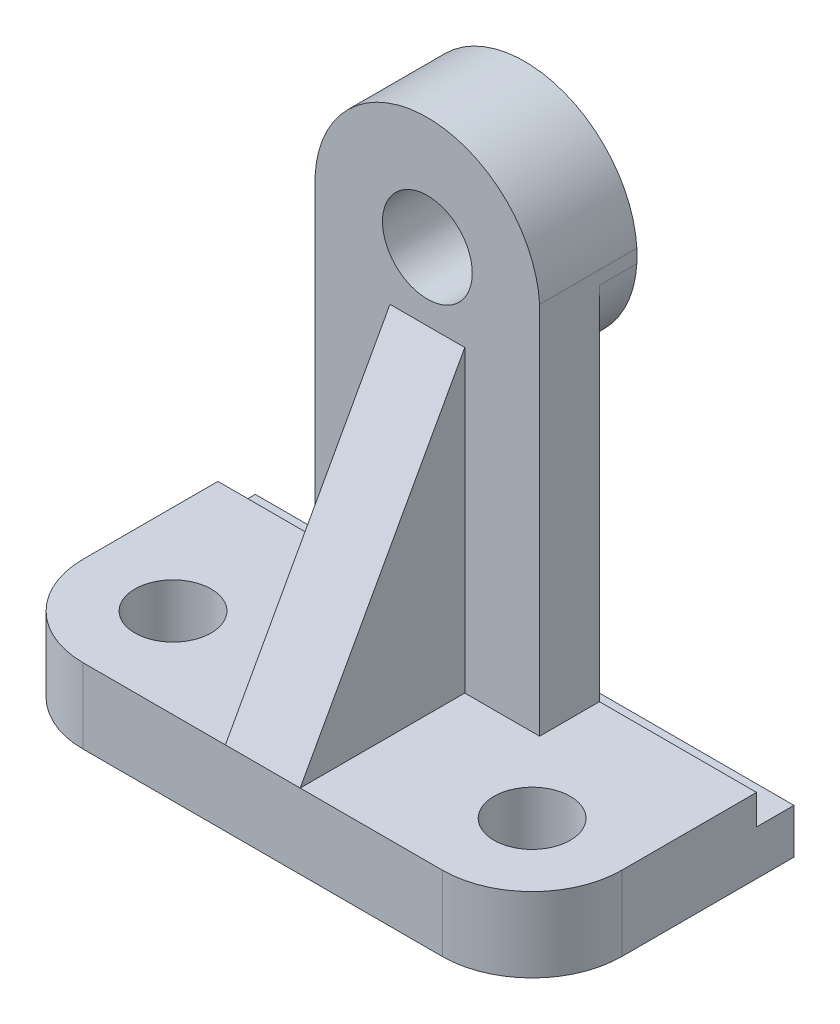
ISO-10303-21;
HEADER;
FILE_DESCRIPTION(('STEP AP214'),'2;1');
FILE_NAME('part.step','',(''),(''),'','','');
FILE_SCHEMA(('AUTOMOTIVE_DESIGN { 1 0 10303 214 1 1 1 1 }'));
ENDSEC;
DATA;
#1=APPLICATION_CONTEXT('core data for automotive mechanical design processes');
#2=APPLICATION_PROTOCOL_DEFINITION('international standard','automotive_design',2000,#1);
#3=PRODUCT_CONTEXT('',#1,'mechanical');
#4=PRODUCT('Part','Part','',(#3));
#5=PRODUCT_RELATED_PRODUCT_CATEGORY('part','',(#4));
#6=PRODUCT_DEFINITION_FORMATION('','',#4);
#7=PRODUCT_DEFINITION_CONTEXT('part definition',#1,'design');
#8=PRODUCT_DEFINITION('design','',#6,#7);
#9=PRODUCT_DEFINITION_SHAPE('','',#8);
#10=(LENGTH_UNIT() NAMED_UNIT(*) SI_UNIT(.MILLI.,.METRE.));
#11=(NAMED_UNIT(*) PLANE_ANGLE_UNIT() SI_UNIT($,.RADIAN.));
#12=(NAMED_UNIT(*) SI_UNIT($,.STERADIAN.) SOLID_ANGLE_UNIT());
#13=UNCERTAINTY_MEASURE_WITH_UNIT(LENGTH_MEASURE(1.E-05),#10,'distance_accuracy_value','');
#14=(GEOMETRIC_REPRESENTATION_CONTEXT(3) GLOBAL_UNCERTAINTY_ASSIGNED_CONTEXT((#13)) GLOBAL_UNIT_ASSIGNED_CONTEXT((#10,
#11,#12)) REPRESENTATION_CONTEXT('',''));
#15=CARTESIAN_POINT('',(0.,0.,0.));
#16=DIRECTION('',(0.,0.,1.));
#17=DIRECTION('',(1.,0.,0.));
#18=AXIS2_PLACEMENT_3D('',#15,#16,#17);
#19=CARTESIAN_POINT('',(-36.,0.,35.));
#20=DIRECTION('',(0.,1.,0.));
#21=DIRECTION('',(-1.,0.,0.));
#22=AXIS2_PLACEMENT_3D('',#19,#20,#21);
#23=PLANE('',#22);
#24=CARTESIAN_POINT('',(24.,0.,23.));
#25=DIRECTION('',(0.,-1.,0.));
#26=DIRECTION('',(0.,0.,-1.));
#27=AXIS2_PLACEMENT_3D('',#24,#25,#26);
#28=CIRCLE('',#27,5.1);
#29=CARTESIAN_POINT('',(24.,0.,17.9));
#30=VERTEX_POINT('',#29);
#31=EDGE_CURVE('E356',#30,#30,#28,.T.);
#32=ORIENTED_EDGE('',*,*,#31,.T.);
#33=EDGE_LOOP('',(#32));
#34=FACE_BOUND('',#33,.T.);
#35=DIRECTION('',(0.,0.,-1.));
#36=VECTOR('',#35,1.);
#37=CARTESIAN_POINT('',(36.,0.,35.));
#38=LINE('',#37,#36);
#39=CARTESIAN_POINT('',(36.,0.,22.9999999999999));
#40=VERTEX_POINT('',#39);
#41=CARTESIAN_POINT('',(36.,0.,5.));
#42=VERTEX_POINT('',#41);
#43=EDGE_CURVE('E57',#40,#42,#38,.T.);
#44=ORIENTED_EDGE('',*,*,#43,.T.);
#45=DIRECTION('',(1.,0.,0.));
#46=VECTOR('',#45,1.);
#47=CARTESIAN_POINT('',(-36.,0.,5.));
#48=LINE('',#47,#46);
#49=CARTESIAN_POINT('',(15.,0.,5.));
#50=VERTEX_POINT('',#49);
#51=EDGE_CURVE('E224',#50,#42,#48,.T.);
#52=ORIENTED_EDGE('',*,*,#51,.F.);
#53=DIRECTION('',(0.,0.,-1.));
#54=VECTOR('',#53,1.);
#55=CARTESIAN_POINT('',(15.,0.,13.));
#56=LINE('',#55,#54);
#57=CARTESIAN_POINT('',(15.,0.,13.));
#58=VERTEX_POINT('',#57);
#59=EDGE_CURVE('E236',#58,#50,#56,.T.);
#60=ORIENTED_EDGE('',*,*,#59,.F.);
#61=DIRECTION('',(1.,0.,0.));
#62=VECTOR('',#61,1.);
#63=CARTESIAN_POINT('',(0.,0.,13.));
#64=LINE('',#63,#62);
#65=CARTESIAN_POINT('',(5.,0.,13.));
#66=VERTEX_POINT('',#65);
#67=EDGE_CURVE('E270',#66,#58,#64,.T.);
#68=ORIENTED_EDGE('',*,*,#67,.F.);
#69=DIRECTION('',(0.,0.,-1.));
#70=VECTOR('',#69,1.);
#71=CARTESIAN_POINT('',(5.,0.,35.));
#72=LINE('',#71,#70);
#73=CARTESIAN_POINT('',(5.,0.,35.));
#74=VERTEX_POINT('',#73);
#75=EDGE_CURVE('E332',#74,#66,#72,.T.);
#76=ORIENTED_EDGE('',*,*,#75,.F.);
#77=DIRECTION('',(-1.,0.,0.));
#78=VECTOR('',#77,1.);
#79=CARTESIAN_POINT('',(-36.,0.,35.));
#80=LINE('',#79,#78);
#81=CARTESIAN_POINT('',(23.9999999999999,0.,35.));
#82=VERTEX_POINT('',#81);
#83=EDGE_CURVE('E199',#82,#74,#80,.T.);
#84=ORIENTED_EDGE('',*,*,#83,.F.);
#85=CARTESIAN_POINT('',(24.,0.,23.));
#86=DIRECTION('',(0.,-1.,0.));
#87=DIRECTION('',(0.,0.,-1.));
#88=AXIS2_PLACEMENT_3D('',#85,#86,#87);
#89=CIRCLE('',#88,12.);
#90=EDGE_CURVE('E176',#40,#82,#89,.T.);
#91=ORIENTED_EDGE('',*,*,#90,.F.);
#92=EDGE_LOOP('',(#44,#52,#60,#68,#76,#84,#91));
#93=FACE_BOUND('',#92,.T.);
#94=ADVANCED_FACE('F47',(#34,#93),#23,.T.);
#95=CARTESIAN_POINT('',(-36.,-10.,35.));
#96=DIRECTION('',(-1.,0.,0.));
#97=DIRECTION('',(0.,0.,-1.));
#98=AXIS2_PLACEMENT_3D('',#95,#96,#97);
#99=PLANE('',#98);
#100=DIRECTION('',(0.,0.,-1.));
#101=VECTOR('',#100,1.);
#102=CARTESIAN_POINT('',(-36.,0.,35.));
#103=LINE('',#102,#101);
#104=CARTESIAN_POINT('',(-36.,0.,22.9999999999999));
#105=VERTEX_POINT('',#104);
#106=CARTESIAN_POINT('',(-36.,0.,5.));
#107=VERTEX_POINT('',#106);
#108=EDGE_CURVE('E11',#105,#107,#103,.T.);
#109=ORIENTED_EDGE('',*,*,#108,.T.);
#110=DIRECTION('',(0.,1.,0.));
#111=VECTOR('',#110,1.);
#112=CARTESIAN_POINT('',(-36.,-3.99999999999999,5.));
#113=LINE('',#112,#111);
#114=CARTESIAN_POINT('',(-36.,-3.99999999999999,5.));
#115=VERTEX_POINT('',#114);
#116=EDGE_CURVE('E221',#115,#107,#113,.T.);
#117=ORIENTED_EDGE('',*,*,#116,.F.);
#118=DIRECTION('',(0.,0.,1.));
#119=VECTOR('',#118,1.);
#120=CARTESIAN_POINT('',(-36.,-3.99999999999999,0.));
#121=LINE('',#120,#119);
#122=CARTESIAN_POINT('',(-36.,-3.99999999999999,0.));
#123=VERTEX_POINT('',#122);
#124=EDGE_CURVE('E231',#123,#115,#121,.T.);
#125=ORIENTED_EDGE('',*,*,#124,.F.);
#126=DIRECTION('',(0.,-1.,0.));
#127=VECTOR('',#126,1.);
#128=CARTESIAN_POINT('',(-36.,-10.,0.));
#129=LINE('',#128,#127);
#130=CARTESIAN_POINT('',(-36.,-10.,0.));
#131=VERTEX_POINT('',#130);
#132=EDGE_CURVE('E206',#123,#131,#129,.T.);
#133=ORIENTED_EDGE('',*,*,#132,.T.);
#134=DIRECTION('',(0.,0.,-1.));
#135=VECTOR('',#134,1.);
#136=CARTESIAN_POINT('',(-36.,-10.,35.));
#137=LINE('',#136,#135);
#138=CARTESIAN_POINT('',(-36.,-10.,22.9999999999999));
#139=VERTEX_POINT('',#138);
#140=EDGE_CURVE('E192',#139,#131,#137,.T.);
#141=ORIENTED_EDGE('',*,*,#140,.F.);
#142=DIRECTION('',(0.,1.,0.));
#143=VECTOR('',#142,1.);
#144=CARTESIAN_POINT('',(-36.,-10.,22.9999999999999));
#145=LINE('',#144,#143);
#146=EDGE_CURVE('E338',#139,#105,#145,.T.);
#147=ORIENTED_EDGE('',*,*,#146,.T.);
#148=EDGE_LOOP('',(#109,#117,#125,#133,#141,#147));
#149=FACE_BOUND('',#148,.T.);
#150=ADVANCED_FACE('F49',(#149),#99,.T.);
#151=CARTESIAN_POINT('',(-24.,0.,23.));
#152=DIRECTION('',(0.,-1.,0.));
#153=DIRECTION('',(0.,0.,-1.));
#154=AXIS2_PLACEMENT_3D('',#151,#152,#153);
#155=CIRCLE('',#154,5.1);
#156=CARTESIAN_POINT('',(-24.,0.,17.9));
#157=VERTEX_POINT('',#156);
#158=EDGE_CURVE('E364',#157,#157,#155,.T.);
#159=ORIENTED_EDGE('',*,*,#158,.T.);
#160=EDGE_LOOP('',(#159));
#161=FACE_BOUND('',#160,.T.);
#162=CARTESIAN_POINT('',(-24.,0.,23.));
#163=DIRECTION('',(0.,-1.,0.));
#164=DIRECTION('',(0.,0.,-1.));
#165=AXIS2_PLACEMENT_3D('',#162,#163,#164);
#166=CIRCLE('',#165,12.);
#167=CARTESIAN_POINT('',(-23.9999999999999,0.,35.));
#168=VERTEX_POINT('',#167);
#169=EDGE_CURVE('E345',#105,#168,#166,.F.);
#170=ORIENTED_EDGE('',*,*,#169,.T.);
#171=CARTESIAN_POINT('',(-5.,0.,35.));
#172=VERTEX_POINT('',#171);
#173=EDGE_CURVE('E214',#172,#168,#80,.T.);
#174=ORIENTED_EDGE('',*,*,#173,.F.);
#175=DIRECTION('',(0.,0.,-1.));
#176=VECTOR('',#175,1.);
#177=CARTESIAN_POINT('',(-5.,0.,35.));
#178=LINE('',#177,#176);
#179=CARTESIAN_POINT('',(-5.,0.,13.));
#180=VERTEX_POINT('',#179);
#181=EDGE_CURVE('E322',#172,#180,#178,.T.);
#182=ORIENTED_EDGE('',*,*,#181,.T.);
#183=CARTESIAN_POINT('',(-15.,0.,13.));
#184=VERTEX_POINT('',#183);
#185=EDGE_CURVE('E266',#184,#180,#64,.T.);
#186=ORIENTED_EDGE('',*,*,#185,.F.);
#187=DIRECTION('',(0.,0.,-1.));
#188=VECTOR('',#187,1.);
#189=CARTESIAN_POINT('',(-15.,0.,13.));
#190=LINE('',#189,#188);
#191=CARTESIAN_POINT('',(-15.,0.,5.));
#192=VERTEX_POINT('',#191);
#193=EDGE_CURVE('E243',#184,#192,#190,.T.);
#194=ORIENTED_EDGE('',*,*,#193,.T.);
#195=EDGE_CURVE('E210',#107,#192,#48,.T.);
#196=ORIENTED_EDGE('',*,*,#195,.F.);
#197=ORIENTED_EDGE('',*,*,#108,.F.);
#198=EDGE_LOOP('',(#170,#174,#182,#186,#194,#196,#197));
#199=FACE_BOUND('',#198,.T.);
#200=ADVANCED_FACE('F389',(#161,#199),#23,.T.);
#201=CARTESIAN_POINT('',(36.,0.,35.));
#202=DIRECTION('',(1.,0.,0.));
#203=DIRECTION('',(0.,0.,1.));
#204=AXIS2_PLACEMENT_3D('',#201,#202,#203);
#205=PLANE('',#204);
#206=DIRECTION('',(0.,0.,-1.));
#207=VECTOR('',#206,1.);
#208=CARTESIAN_POINT('',(36.,-9.99999999999999,35.));
#209=LINE('',#208,#207);
#210=CARTESIAN_POINT('',(36.,-10.,22.9999999999999));
#211=VERTEX_POINT('',#210);
#212=CARTESIAN_POINT('',(36.,-9.99999999999999,0.));
#213=VERTEX_POINT('',#212);
#214=EDGE_CURVE('E183',#211,#213,#209,.T.);
#215=ORIENTED_EDGE('',*,*,#214,.T.);
#216=DIRECTION('',(0.,1.,0.));
#217=VECTOR('',#216,1.);
#218=CARTESIAN_POINT('',(36.,0.,0.));
#219=LINE('',#218,#217);
#220=CARTESIAN_POINT('',(36.,-3.99999999999999,0.));
#221=VERTEX_POINT('',#220);
#222=EDGE_CURVE('E201',#213,#221,#219,.T.);
#223=ORIENTED_EDGE('',*,*,#222,.T.);
#224=DIRECTION('',(0.,0.,1.));
#225=VECTOR('',#224,1.);
#226=CARTESIAN_POINT('',(36.,-3.99999999999999,0.));
#227=LINE('',#226,#225);
#228=CARTESIAN_POINT('',(36.,-3.99999999999999,5.));
#229=VERTEX_POINT('',#228);
#230=EDGE_CURVE('E232',#221,#229,#227,.T.);
#231=ORIENTED_EDGE('',*,*,#230,.T.);
#232=DIRECTION('',(0.,1.,0.));
#233=VECTOR('',#232,1.);
#234=CARTESIAN_POINT('',(36.,-3.99999999999999,5.));
#235=LINE('',#234,#233);
#236=EDGE_CURVE('E228',#229,#42,#235,.T.);
#237=ORIENTED_EDGE('',*,*,#236,.T.);
#238=ORIENTED_EDGE('',*,*,#43,.F.);
#239=DIRECTION('',(0.,1.,0.));
#240=VECTOR('',#239,1.);
#241=CARTESIAN_POINT('',(36.,-10.,22.9999999999999));
#242=LINE('',#241,#240);
#243=EDGE_CURVE('E169',#211,#40,#242,.T.);
#244=ORIENTED_EDGE('',*,*,#243,.F.);
#245=EDGE_LOOP('',(#215,#223,#231,#237,#238,#244));
#246=FACE_BOUND('',#245,.T.);
#247=ADVANCED_FACE('F181',(#246),#205,.T.);
#248=CARTESIAN_POINT('',(36.,-9.99999999999999,35.));
#249=DIRECTION('',(0.,-1.,0.));
#250=DIRECTION('',(1.,0.,0.));
#251=AXIS2_PLACEMENT_3D('',#248,#249,#250);
#252=PLANE('',#251);
#253=CARTESIAN_POINT('',(-24.,-10.,23.));
#254=DIRECTION('',(0.,-1.,0.));
#255=DIRECTION('',(0.,0.,-1.));
#256=AXIS2_PLACEMENT_3D('',#253,#254,#255);
#257=CIRCLE('',#256,5.1);
#258=CARTESIAN_POINT('',(-24.,-10.,17.9));
#259=VERTEX_POINT('',#258);
#260=EDGE_CURVE('E349',#259,#259,#257,.T.);
#261=ORIENTED_EDGE('',*,*,#260,.F.);
#262=EDGE_LOOP('',(#261));
#263=FACE_BOUND('',#262,.T.);
#264=CARTESIAN_POINT('',(24.,-10.,23.));
#265=DIRECTION('',(0.,-1.,0.));
#266=DIRECTION('',(0.,0.,-1.));
#267=AXIS2_PLACEMENT_3D('',#264,#265,#266);
#268=CIRCLE('',#267,5.1);
#269=CARTESIAN_POINT('',(24.,-10.,17.9));
#270=VERTEX_POINT('',#269);
#271=EDGE_CURVE('E360',#270,#270,#268,.T.);
#272=ORIENTED_EDGE('',*,*,#271,.F.);
#273=EDGE_LOOP('',(#272));
#274=FACE_BOUND('',#273,.T.);
#275=DIRECTION('',(1.,0.,0.));
#276=VECTOR('',#275,1.);
#277=CARTESIAN_POINT('',(36.,-9.99999999999999,35.));
#278=LINE('',#277,#276);
#279=CARTESIAN_POINT('',(-23.9999999999999,-10.,35.));
#280=VERTEX_POINT('',#279);
#281=CARTESIAN_POINT('',(23.9999999999999,-9.99999999999999,35.));
#282=VERTEX_POINT('',#281);
#283=EDGE_CURVE('E204',#280,#282,#278,.T.);
#284=ORIENTED_EDGE('',*,*,#283,.F.);
#285=CARTESIAN_POINT('',(-24.,-10.,23.));
#286=DIRECTION('',(0.,-1.,0.));
#287=DIRECTION('',(0.,0.,-1.));
#288=AXIS2_PLACEMENT_3D('',#285,#286,#287);
#289=CIRCLE('',#288,12.);
#290=EDGE_CURVE('E342',#139,#280,#289,.F.);
#291=ORIENTED_EDGE('',*,*,#290,.F.);
#292=ORIENTED_EDGE('',*,*,#140,.T.);
#293=DIRECTION('',(1.,0.,0.));
#294=VECTOR('',#293,1.);
#295=CARTESIAN_POINT('',(36.,-9.99999999999999,0.));
#296=LINE('',#295,#294);
#297=EDGE_CURVE('E189',#131,#213,#296,.T.);
#298=ORIENTED_EDGE('',*,*,#297,.T.);
#299=ORIENTED_EDGE('',*,*,#214,.F.);
#300=CARTESIAN_POINT('',(24.,-10.,23.));
#301=DIRECTION('',(0.,-1.,0.));
#302=DIRECTION('',(0.,0.,-1.));
#303=AXIS2_PLACEMENT_3D('',#300,#301,#302);
#304=CIRCLE('',#303,12.);
#305=EDGE_CURVE('E166',#211,#282,#304,.T.);
#306=ORIENTED_EDGE('',*,*,#305,.T.);
#307=EDGE_LOOP('',(#284,#291,#292,#298,#299,#306));
#308=FACE_BOUND('',#307,.T.);
#309=ADVANCED_FACE('F187',(#263,#274,#308),#252,.T.);
#310=CARTESIAN_POINT('',(0.,0.,13.));
#311=DIRECTION('',(0.,0.,-1.));
#312=DIRECTION('',(1.,0.,0.));
#313=AXIS2_PLACEMENT_3D('',#310,#311,#312);
#314=PLANE('',#313);
#315=CARTESIAN_POINT('',(0.,49.099821292408,13.));
#316=DIRECTION('',(0.,0.,1.));
#317=DIRECTION('',(1.,0.,0.));
#318=AXIS2_PLACEMENT_3D('',#315,#316,#317);
#319=CIRCLE('',#318,6.);
#320=CARTESIAN_POINT('',(6.00000000000005,49.099821292408,13.));
#321=VERTEX_POINT('',#320);
#322=EDGE_CURVE('E302',#321,#321,#319,.T.);
#323=ORIENTED_EDGE('',*,*,#322,.F.);
#324=EDGE_LOOP('',(#323));
#325=FACE_BOUND('',#324,.T.);
#326=DIRECTION('',(0.,1.,0.));
#327=VECTOR('',#326,1.);
#328=CARTESIAN_POINT('',(5.,0.,13.));
#329=LINE('',#328,#327);
#330=CARTESIAN_POINT('',(5.,40.,13.));
#331=VERTEX_POINT('',#330);
#332=EDGE_CURVE('E313',#66,#331,#329,.T.);
#333=ORIENTED_EDGE('',*,*,#332,.F.);
#334=ORIENTED_EDGE('',*,*,#67,.T.);
#335=DIRECTION('',(0.,-1.,0.));
#336=VECTOR('',#335,1.);
#337=CARTESIAN_POINT('',(15.,0.,13.));
#338=LINE('',#337,#336);
#339=CARTESIAN_POINT('',(15.,50.0000000000018,13.));
#340=VERTEX_POINT('',#339);
#341=EDGE_CURVE('E247',#340,#58,#338,.T.);
#342=ORIENTED_EDGE('',*,*,#341,.F.);
#343=CARTESIAN_POINT('',(0.,49.099821292408,13.));
#344=DIRECTION('',(0.,0.,1.));
#345=DIRECTION('',(1.,0.,0.));
#346=AXIS2_PLACEMENT_3D('',#343,#344,#345);
#347=CIRCLE('',#346,15.0269864479078);
#348=CARTESIAN_POINT('',(-15.,50.,13.));
#349=VERTEX_POINT('',#348);
#350=EDGE_CURVE('E279',#340,#349,#347,.T.);
#351=ORIENTED_EDGE('',*,*,#350,.T.);
#352=DIRECTION('',(0.,1.,0.));
#353=VECTOR('',#352,1.);
#354=CARTESIAN_POINT('',(-15.,0.,13.));
#355=LINE('',#354,#353);
#356=EDGE_CURVE('E254',#184,#349,#355,.T.);
#357=ORIENTED_EDGE('',*,*,#356,.F.);
#358=ORIENTED_EDGE('',*,*,#185,.T.);
#359=DIRECTION('',(0.,1.,0.));
#360=VECTOR('',#359,1.);
#361=CARTESIAN_POINT('',(-5.,0.,13.));
#362=LINE('',#361,#360);
#363=CARTESIAN_POINT('',(-5.,40.,13.));
#364=VERTEX_POINT('',#363);
#365=EDGE_CURVE('E317',#180,#364,#362,.T.);
#366=ORIENTED_EDGE('',*,*,#365,.T.);
#367=DIRECTION('',(-1.,0.,0.));
#368=VECTOR('',#367,1.);
#369=CARTESIAN_POINT('',(5.,40.,13.));
#370=LINE('',#369,#368);
#371=EDGE_CURVE('E312',#331,#364,#370,.T.);
#372=ORIENTED_EDGE('',*,*,#371,.F.);
#373=EDGE_LOOP('',(#333,#334,#342,#351,#357,#358,#366,#372));
#374=FACE_BOUND('',#373,.T.);
#375=ADVANCED_FACE('F377',(#325,#374),#314,.F.);
#376=CARTESIAN_POINT('',(0.,0.,35.));
#377=DIRECTION('',(0.,0.,1.));
#378=DIRECTION('',(-1.,0.,0.));
#379=AXIS2_PLACEMENT_3D('',#376,#377,#378);
#380=PLANE('',#379);
#381=DIRECTION('',(0.,1.,0.));
#382=VECTOR('',#381,1.);
#383=CARTESIAN_POINT('',(23.9999999999999,-10.,35.));
#384=LINE('',#383,#382);
#385=EDGE_CURVE('E65',#282,#82,#384,.T.);
#386=ORIENTED_EDGE('',*,*,#385,.T.);
#387=ORIENTED_EDGE('',*,*,#83,.T.);
#388=DIRECTION('',(-1.,0.,0.));
#389=VECTOR('',#388,1.);
#390=CARTESIAN_POINT('',(5.,0.,35.));
#391=LINE('',#390,#389);
#392=EDGE_CURVE('E309',#74,#172,#391,.T.);
#393=ORIENTED_EDGE('',*,*,#392,.T.);
#394=ORIENTED_EDGE('',*,*,#173,.T.);
#395=DIRECTION('',(0.,1.,0.));
#396=VECTOR('',#395,1.);
#397=CARTESIAN_POINT('',(-23.9999999999999,-10.,35.));
#398=LINE('',#397,#396);
#399=EDGE_CURVE('E73',#280,#168,#398,.T.);
#400=ORIENTED_EDGE('',*,*,#399,.F.);
#401=ORIENTED_EDGE('',*,*,#283,.T.);
#402=EDGE_LOOP('',(#386,#387,#393,#394,#400,#401));
#403=FACE_BOUND('',#402,.T.);
#404=ADVANCED_FACE('F397',(#403),#380,.T.);
#405=CARTESIAN_POINT('',(0.,0.,0.));
#406=DIRECTION('',(0.,0.,1.));
#407=DIRECTION('',(-1.,0.,0.));
#408=AXIS2_PLACEMENT_3D('',#405,#406,#407);
#409=PLANE('',#408);
#410=ORIENTED_EDGE('',*,*,#222,.F.);
#411=ORIENTED_EDGE('',*,*,#297,.F.);
#412=ORIENTED_EDGE('',*,*,#132,.F.);
#413=DIRECTION('',(1.,0.,0.));
#414=VECTOR('',#413,1.);
#415=CARTESIAN_POINT('',(-36.,-3.99999999999999,0.));
#416=LINE('',#415,#414);
#417=EDGE_CURVE('E217',#123,#221,#416,.T.);
#418=ORIENTED_EDGE('',*,*,#417,.T.);
#419=EDGE_LOOP('',(#410,#411,#412,#418));
#420=FACE_BOUND('',#419,.T.);
#421=ADVANCED_FACE('F409',(#420),#409,.F.);
#422=CARTESIAN_POINT('',(-36.,-3.99999999999999,5.));
#423=DIRECTION('',(0.,0.,1.));
#424=DIRECTION('',(-1.,0.,0.));
#425=AXIS2_PLACEMENT_3D('',#422,#423,#424);
#426=PLANE('',#425);
#427=ORIENTED_EDGE('',*,*,#236,.F.);
#428=DIRECTION('',(1.,0.,0.));
#429=VECTOR('',#428,1.);
#430=CARTESIAN_POINT('',(-36.,-3.99999999999999,5.));
#431=LINE('',#430,#429);
#432=EDGE_CURVE('E220',#115,#229,#431,.T.);
#433=ORIENTED_EDGE('',*,*,#432,.F.);
#434=ORIENTED_EDGE('',*,*,#116,.T.);
#435=ORIENTED_EDGE('',*,*,#195,.T.);
#436=DIRECTION('',(0.,1.,0.));
#437=VECTOR('',#436,1.);
#438=CARTESIAN_POINT('',(-15.,0.,5.));
#439=LINE('',#438,#437);
#440=CARTESIAN_POINT('',(-15.,48.1996425848158,5.));
#441=VERTEX_POINT('',#440);
#442=EDGE_CURVE('E255',#192,#441,#439,.T.);
#443=ORIENTED_EDGE('',*,*,#442,.T.);
#444=CARTESIAN_POINT('',(0.,49.099821292408,5.));
#445=DIRECTION('',(0.,0.,1.));
#446=DIRECTION('',(1.,0.,0.));
#447=AXIS2_PLACEMENT_3D('',#444,#445,#446);
#448=CIRCLE('',#447,15.0269864479078);
#449=CARTESIAN_POINT('',(15.,48.1996425848141,5.));
#450=VERTEX_POINT('',#449);
#451=EDGE_CURVE('E259',#441,#450,#448,.T.);
#452=ORIENTED_EDGE('',*,*,#451,.T.);
#453=DIRECTION('',(0.,-1.,0.));
#454=VECTOR('',#453,1.);
#455=CARTESIAN_POINT('',(15.,0.,5.));
#456=LINE('',#455,#454);
#457=EDGE_CURVE('E251',#450,#50,#456,.T.);
#458=ORIENTED_EDGE('',*,*,#457,.T.);
#459=ORIENTED_EDGE('',*,*,#51,.T.);
#460=EDGE_LOOP('',(#427,#433,#434,#435,#443,#452,#458,#459));
#461=FACE_BOUND('',#460,.T.);
#462=ADVANCED_FACE('F415',(#461),#426,.F.);
#463=CARTESIAN_POINT('',(-36.,-3.99999999999999,0.));
#464=DIRECTION('',(0.,-1.,0.));
#465=DIRECTION('',(0.,0.,1.));
#466=AXIS2_PLACEMENT_3D('',#463,#464,#465);
#467=PLANE('',#466);
#468=ORIENTED_EDGE('',*,*,#230,.F.);
#469=ORIENTED_EDGE('',*,*,#417,.F.);
#470=ORIENTED_EDGE('',*,*,#124,.T.);
#471=ORIENTED_EDGE('',*,*,#432,.T.);
#472=EDGE_LOOP('',(#468,#469,#470,#471));
#473=FACE_BOUND('',#472,.T.);
#474=ADVANCED_FACE('F413',(#473),#467,.F.);
#475=CARTESIAN_POINT('',(15.,0.,13.));
#476=DIRECTION('',(-1.,0.,0.));
#477=DIRECTION('',(0.,-1.,0.));
#478=AXIS2_PLACEMENT_3D('',#475,#476,#477);
#479=PLANE('',#478);
#480=ORIENTED_EDGE('',*,*,#457,.F.);
#481=DIRECTION('',(0.,0.,-1.));
#482=VECTOR('',#481,1.);
#483=CARTESIAN_POINT('',(15.,48.1996425848141,13.));
#484=LINE('',#483,#482);
#485=CARTESIAN_POINT('',(15.,48.1996425848141,0.));
#486=VERTEX_POINT('',#485);
#487=EDGE_CURVE('E263',#450,#486,#484,.T.);
#488=ORIENTED_EDGE('',*,*,#487,.T.);
#489=DIRECTION('',(0.,-1.,0.));
#490=VECTOR('',#489,1.);
#491=CARTESIAN_POINT('',(15.,0.,0.));
#492=LINE('',#491,#490);
#493=CARTESIAN_POINT('',(15.,50.0000000000018,0.));
#494=VERTEX_POINT('',#493);
#495=EDGE_CURVE('E298',#494,#486,#492,.T.);
#496=ORIENTED_EDGE('',*,*,#495,.F.);
#497=DIRECTION('',(0.,0.,-1.));
#498=VECTOR('',#497,1.);
#499=CARTESIAN_POINT('',(15.,50.0000000000018,13.));
#500=LINE('',#499,#498);
#501=EDGE_CURVE('E274',#340,#494,#500,.T.);
#502=ORIENTED_EDGE('',*,*,#501,.F.);
#503=ORIENTED_EDGE('',*,*,#341,.T.);
#504=ORIENTED_EDGE('',*,*,#59,.T.);
#505=EDGE_LOOP('',(#480,#488,#496,#502,#503,#504));
#506=FACE_BOUND('',#505,.T.);
#507=ADVANCED_FACE('F433',(#506),#479,.F.);
#508=CARTESIAN_POINT('',(-15.,0.,13.));
#509=DIRECTION('',(1.,0.,0.));
#510=DIRECTION('',(0.,0.,1.));
#511=AXIS2_PLACEMENT_3D('',#508,#509,#510);
#512=PLANE('',#511);
#513=ORIENTED_EDGE('',*,*,#442,.F.);
#514=ORIENTED_EDGE('',*,*,#193,.F.);
#515=ORIENTED_EDGE('',*,*,#356,.T.);
#516=DIRECTION('',(0.,0.,-1.));
#517=VECTOR('',#516,1.);
#518=CARTESIAN_POINT('',(-15.,50.,13.));
#519=LINE('',#518,#517);
#520=CARTESIAN_POINT('',(-15.,50.,0.));
#521=VERTEX_POINT('',#520);
#522=EDGE_CURVE('E278',#349,#521,#519,.T.);
#523=ORIENTED_EDGE('',*,*,#522,.T.);
#524=DIRECTION('',(0.,1.,0.));
#525=VECTOR('',#524,1.);
#526=CARTESIAN_POINT('',(-15.,0.,0.));
#527=LINE('',#526,#525);
#528=CARTESIAN_POINT('',(-15.,48.1996425848158,0.));
#529=VERTEX_POINT('',#528);
#530=EDGE_CURVE('E290',#529,#521,#527,.T.);
#531=ORIENTED_EDGE('',*,*,#530,.F.);
#532=DIRECTION('',(0.,0.,-1.));
#533=VECTOR('',#532,1.);
#534=CARTESIAN_POINT('',(-15.,48.1996425848158,13.));
#535=LINE('',#534,#533);
#536=EDGE_CURVE('E283',#441,#529,#535,.T.);
#537=ORIENTED_EDGE('',*,*,#536,.F.);
#538=EDGE_LOOP('',(#513,#514,#515,#523,#531,#537));
#539=FACE_BOUND('',#538,.T.);
#540=ADVANCED_FACE('F426',(#539),#512,.F.);
#541=CARTESIAN_POINT('',(0.,49.099821292408,13.));
#542=DIRECTION('',(0.,0.,-1.));
#543=DIRECTION('',(1.,0.,0.));
#544=AXIS2_PLACEMENT_3D('',#541,#542,#543);
#545=CYLINDRICAL_SURFACE('',#544,15.0269864479078);
#546=ORIENTED_EDGE('',*,*,#451,.F.);
#547=ORIENTED_EDGE('',*,*,#536,.T.);
#548=CARTESIAN_POINT('',(0.,49.099821292408,0.));
#549=DIRECTION('',(0.,0.,1.));
#550=DIRECTION('',(1.,0.,0.));
#551=AXIS2_PLACEMENT_3D('',#548,#549,#550);
#552=CIRCLE('',#551,15.0269864479078);
#553=EDGE_CURVE('E294',#529,#486,#552,.T.);
#554=ORIENTED_EDGE('',*,*,#553,.T.);
#555=ORIENTED_EDGE('',*,*,#487,.F.);
#556=EDGE_LOOP('',(#546,#547,#554,#555));
#557=FACE_BOUND('',#556,.T.);
#558=ADVANCED_FACE('F430',(#557),#545,.T.);
#559=EDGE_CURVE('E295',#494,#521,#552,.T.);
#560=ORIENTED_EDGE('',*,*,#559,.T.);
#561=ORIENTED_EDGE('',*,*,#522,.F.);
#562=ORIENTED_EDGE('',*,*,#350,.F.);
#563=ORIENTED_EDGE('',*,*,#501,.T.);
#564=EDGE_LOOP('',(#560,#561,#562,#563));
#565=FACE_BOUND('',#564,.T.);
#566=ADVANCED_FACE('F448',(#565),#545,.T.);
#567=CARTESIAN_POINT('',(0.,0.,0.));
#568=DIRECTION('',(0.,0.,-1.));
#569=DIRECTION('',(1.,0.,0.));
#570=AXIS2_PLACEMENT_3D('',#567,#568,#569);
#571=PLANE('',#570);
#572=CARTESIAN_POINT('',(0.,49.099821292408,0.));
#573=DIRECTION('',(0.,0.,1.));
#574=DIRECTION('',(1.,0.,0.));
#575=AXIS2_PLACEMENT_3D('',#572,#573,#574);
#576=CIRCLE('',#575,6.);
#577=CARTESIAN_POINT('',(6.00000000000005,49.099821292408,0.));
#578=VERTEX_POINT('',#577);
#579=EDGE_CURVE('E51',#578,#578,#576,.T.);
#580=ORIENTED_EDGE('',*,*,#579,.T.);
#581=EDGE_LOOP('',(#580));
#582=FACE_BOUND('',#581,.T.);
#583=ORIENTED_EDGE('',*,*,#495,.T.);
#584=ORIENTED_EDGE('',*,*,#553,.F.);
#585=ORIENTED_EDGE('',*,*,#530,.T.);
#586=ORIENTED_EDGE('',*,*,#559,.F.);
#587=EDGE_LOOP('',(#583,#584,#585,#586));
#588=FACE_BOUND('',#587,.T.);
#589=ADVANCED_FACE('F450',(#582,#588),#571,.T.);
#590=CARTESIAN_POINT('',(0.,49.099821292408,35.));
#591=DIRECTION('',(0.,0.,-1.));
#592=DIRECTION('',(1.,0.,0.));
#593=AXIS2_PLACEMENT_3D('',#590,#591,#592);
#594=CYLINDRICAL_SURFACE('',#593,6.);
#595=ORIENTED_EDGE('',*,*,#579,.F.);
#596=EDGE_LOOP('',(#595));
#597=FACE_BOUND('',#596,.T.);
#598=ORIENTED_EDGE('',*,*,#322,.T.);
#599=EDGE_LOOP('',(#598));
#600=FACE_BOUND('',#599,.T.);
#601=ADVANCED_FACE('F452',(#597,#600),#594,.F.);
#602=CARTESIAN_POINT('',(5.,40.,13.));
#603=DIRECTION('',(0.,0.481918749772156,0.876215908676647));
#604=DIRECTION('',(0.,0.876215908676647,-0.481918749772156));
#605=AXIS2_PLACEMENT_3D('',#602,#603,#604);
#606=PLANE('',#605);
#607=DIRECTION('',(0.,-0.876215908676647,0.481918749772156));
#608=VECTOR('',#607,1.);
#609=CARTESIAN_POINT('',(-5.,40.,13.));
#610=LINE('',#609,#608);
#611=EDGE_CURVE('E326',#364,#172,#610,.T.);
#612=ORIENTED_EDGE('',*,*,#611,.T.);
#613=ORIENTED_EDGE('',*,*,#392,.F.);
#614=DIRECTION('',(0.,-0.876215908676647,0.481918749772156));
#615=VECTOR('',#614,1.);
#616=CARTESIAN_POINT('',(5.,40.,13.));
#617=LINE('',#616,#615);
#618=EDGE_CURVE('E321',#331,#74,#617,.T.);
#619=ORIENTED_EDGE('',*,*,#618,.F.);
#620=ORIENTED_EDGE('',*,*,#371,.T.);
#621=EDGE_LOOP('',(#612,#613,#619,#620));
#622=FACE_BOUND('',#621,.T.);
#623=ADVANCED_FACE('F443',(#622),#606,.T.);
#624=CARTESIAN_POINT('',(5.,0.,0.));
#625=DIRECTION('',(-1.,0.,0.));
#626=DIRECTION('',(0.,0.,-1.));
#627=AXIS2_PLACEMENT_3D('',#624,#625,#626);
#628=PLANE('',#627);
#629=ORIENTED_EDGE('',*,*,#618,.T.);
#630=ORIENTED_EDGE('',*,*,#75,.T.);
#631=ORIENTED_EDGE('',*,*,#332,.T.);
#632=EDGE_LOOP('',(#629,#630,#631));
#633=FACE_BOUND('',#632,.T.);
#634=ADVANCED_FACE('F441',(#633),#628,.F.);
#635=CARTESIAN_POINT('',(-5.,0.,0.));
#636=DIRECTION('',(-1.,0.,0.));
#637=DIRECTION('',(0.,0.,-1.));
#638=AXIS2_PLACEMENT_3D('',#635,#636,#637);
#639=PLANE('',#638);
#640=ORIENTED_EDGE('',*,*,#611,.F.);
#641=ORIENTED_EDGE('',*,*,#365,.F.);
#642=ORIENTED_EDGE('',*,*,#181,.F.);
#643=EDGE_LOOP('',(#640,#641,#642));
#644=FACE_BOUND('',#643,.T.);
#645=ADVANCED_FACE('F445',(#644),#639,.T.);
#646=CARTESIAN_POINT('',(-24.,-10.,23.));
#647=DIRECTION('',(0.,1.,0.));
#648=DIRECTION('',(0.,0.,-1.));
#649=AXIS2_PLACEMENT_3D('',#646,#647,#648);
#650=CYLINDRICAL_SURFACE('',#649,12.);
#651=ORIENTED_EDGE('',*,*,#169,.F.);
#652=ORIENTED_EDGE('',*,*,#146,.F.);
#653=ORIENTED_EDGE('',*,*,#290,.T.);
#654=ORIENTED_EDGE('',*,*,#399,.T.);
#655=EDGE_LOOP('',(#651,#652,#653,#654));
#656=FACE_BOUND('',#655,.T.);
#657=ADVANCED_FACE('F402',(#656),#650,.T.);
#658=CARTESIAN_POINT('',(24.,-10.,23.));
#659=DIRECTION('',(0.,1.,0.));
#660=DIRECTION('',(0.,0.,-1.));
#661=AXIS2_PLACEMENT_3D('',#658,#659,#660);
#662=CYLINDRICAL_SURFACE('',#661,12.);
#663=ORIENTED_EDGE('',*,*,#90,.T.);
#664=ORIENTED_EDGE('',*,*,#385,.F.);
#665=ORIENTED_EDGE('',*,*,#305,.F.);
#666=ORIENTED_EDGE('',*,*,#243,.T.);
#667=EDGE_LOOP('',(#663,#664,#665,#666));
#668=FACE_BOUND('',#667,.T.);
#669=ADVANCED_FACE('F168',(#668),#662,.T.);
#670=CARTESIAN_POINT('',(24.,-10.,23.));
#671=DIRECTION('',(0.,1.,0.));
#672=DIRECTION('',(0.,0.,-1.));
#673=AXIS2_PLACEMENT_3D('',#670,#671,#672);
#674=CYLINDRICAL_SURFACE('',#673,5.1);
#675=ORIENTED_EDGE('',*,*,#271,.T.);
#676=EDGE_LOOP('',(#675));
#677=FACE_BOUND('',#676,.T.);
#678=ORIENTED_EDGE('',*,*,#31,.F.);
#679=EDGE_LOOP('',(#678));
#680=FACE_BOUND('',#679,.T.);
#681=ADVANCED_FACE('F380',(#677,#680),#674,.F.);
#682=CARTESIAN_POINT('',(-24.,-10.,23.));
#683=DIRECTION('',(0.,1.,0.));
#684=DIRECTION('',(0.,0.,-1.));
#685=AXIS2_PLACEMENT_3D('',#682,#683,#684);
#686=CYLINDRICAL_SURFACE('',#685,5.1);
#687=ORIENTED_EDGE('',*,*,#260,.T.);
#688=EDGE_LOOP('',(#687));
#689=FACE_BOUND('',#688,.T.);
#690=ORIENTED_EDGE('',*,*,#158,.F.);
#691=EDGE_LOOP('',(#690));
#692=FACE_BOUND('',#691,.T.);
#693=ADVANCED_FACE('F372',(#689,#692),#686,.F.);
#694=CLOSED_SHELL('',(#94,#150,#200,#247,#309,#375,#404,#421,#462,#474,#507,#540,#558,#566,#589,
#601,#623,#634,#645,#657,#669,#681,#693));
#695=MANIFOLD_SOLID_BREP('B2',#694);
#696=ADVANCED_BREP_SHAPE_REPRESENTATION('',(#18,#695),#14);
#697=SHAPE_DEFINITION_REPRESENTATION(#9,#696);
ENDSEC;
END-ISO-10303-21;
